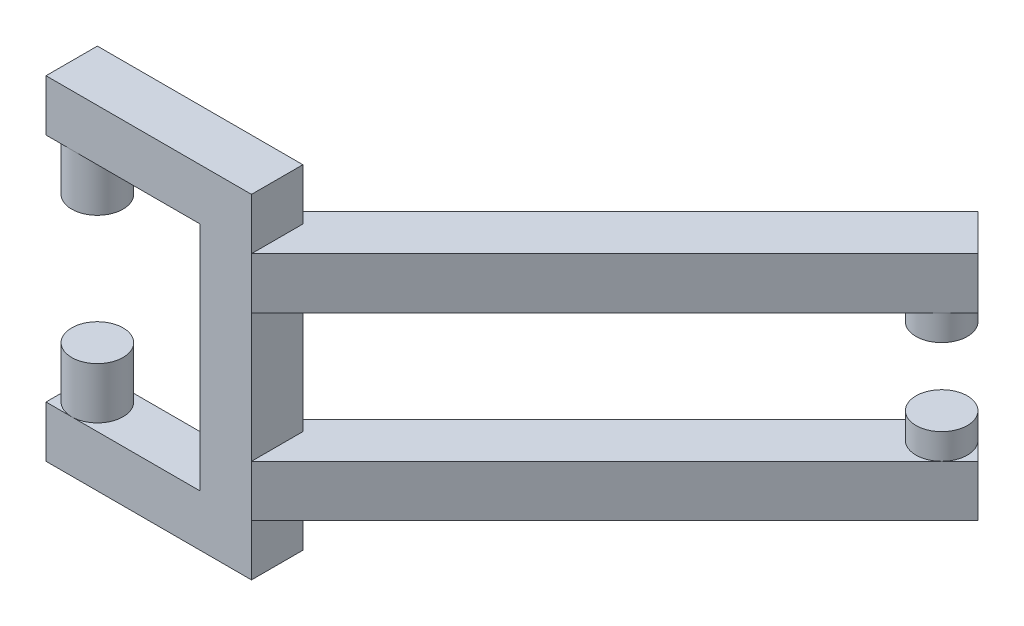
ISO-10303-21;
HEADER;
FILE_DESCRIPTION(('STEP AP214'),'2;1');
FILE_NAME('part.step','',(''),(''),'','','');
FILE_SCHEMA(('AUTOMOTIVE_DESIGN { 1 0 10303 214 1 1 1 1 }'));
ENDSEC;
DATA;
#1=APPLICATION_CONTEXT('core data for automotive mechanical design processes');
#2=APPLICATION_PROTOCOL_DEFINITION('international standard','automotive_design',2000,#1);
#3=PRODUCT_CONTEXT('',#1,'mechanical');
#4=PRODUCT('Part','Part','',(#3));
#5=PRODUCT_RELATED_PRODUCT_CATEGORY('part','',(#4));
#6=PRODUCT_DEFINITION_FORMATION('','',#4);
#7=PRODUCT_DEFINITION_CONTEXT('part definition',#1,'design');
#8=PRODUCT_DEFINITION('design','',#6,#7);
#9=PRODUCT_DEFINITION_SHAPE('','',#8);
#10=(LENGTH_UNIT() NAMED_UNIT(*) SI_UNIT(.MILLI.,.METRE.));
#11=(NAMED_UNIT(*) PLANE_ANGLE_UNIT() SI_UNIT($,.RADIAN.));
#12=(NAMED_UNIT(*) SI_UNIT($,.STERADIAN.) SOLID_ANGLE_UNIT());
#13=UNCERTAINTY_MEASURE_WITH_UNIT(LENGTH_MEASURE(1.E-05),#10,'distance_accuracy_value','');
#14=(GEOMETRIC_REPRESENTATION_CONTEXT(3) GLOBAL_UNCERTAINTY_ASSIGNED_CONTEXT((#13)) GLOBAL_UNIT_ASSIGNED_CONTEXT((#10,
#11,#12)) REPRESENTATION_CONTEXT('',''));
#15=CARTESIAN_POINT('',(0.,0.,0.));
#16=DIRECTION('',(0.,0.,1.));
#17=DIRECTION('',(1.,0.,0.));
#18=AXIS2_PLACEMENT_3D('',#15,#16,#17);
#19=CARTESIAN_POINT('',(0.,-45.,0.));
#20=DIRECTION('',(0.,-1.,0.));
#21=DIRECTION('',(0.,0.,1.));
#22=AXIS2_PLACEMENT_3D('',#19,#20,#21);
#23=PLANE('',#22);
#24=CARTESIAN_POINT('',(103.639610306789,-45.,-60.7106781186547));
#25=DIRECTION('',(0.,1.,0.));
#26=DIRECTION('',(0.,0.,1.));
#27=AXIS2_PLACEMENT_3D('',#24,#25,#26);
#28=CIRCLE('',#27,5.00000000000001);
#29=CARTESIAN_POINT('',(100.104076400857,-45.,-64.2462120245874));
#30=VERTEX_POINT('',#29);
#31=CARTESIAN_POINT('',(107.175144212722,-45.,-57.1751442127219));
#32=VERTEX_POINT('',#31);
#33=EDGE_CURVE('E216',#30,#32,#28,.T.);
#34=ORIENTED_EDGE('',*,*,#33,.F.);
#35=DIRECTION('',(0.707106781186549,0.,-0.707106781186546));
#36=VECTOR('',#35,1.);
#37=CARTESIAN_POINT('',(17.9289321881345,-45.,17.9289321881345));
#38=LINE('',#37,#36);
#39=CARTESIAN_POINT('',(35.8578643762691,-45.,0.));
#40=VERTEX_POINT('',#39);
#41=EDGE_CURVE('E198',#40,#30,#38,.T.);
#42=ORIENTED_EDGE('',*,*,#41,.F.);
#43=DIRECTION('',(-1.,0.,0.));
#44=VECTOR('',#43,1.);
#45=CARTESIAN_POINT('',(0.,-45.,0.));
#46=LINE('',#45,#44);
#47=CARTESIAN_POINT('',(40.,-45.,0.));
#48=VERTEX_POINT('',#47);
#49=EDGE_CURVE('E255',#48,#40,#46,.T.);
#50=ORIENTED_EDGE('',*,*,#49,.F.);
#51=DIRECTION('',(0.,0.,1.));
#52=VECTOR('',#51,1.);
#53=CARTESIAN_POINT('',(40.,-45.,10.));
#54=LINE('',#53,#52);
#55=CARTESIAN_POINT('',(40.,-45.,10.));
#56=VERTEX_POINT('',#55);
#57=EDGE_CURVE('E257',#48,#56,#54,.T.);
#58=ORIENTED_EDGE('',*,*,#57,.T.);
#59=DIRECTION('',(-0.707106781186549,0.,0.707106781186546));
#60=VECTOR('',#59,1.);
#61=CARTESIAN_POINT('',(24.9999999999999,-45.,25.));
#62=LINE('',#61,#60);
#63=EDGE_CURVE('E218',#32,#56,#62,.T.);
#64=ORIENTED_EDGE('',*,*,#63,.F.);
#65=EDGE_LOOP('',(#34,#42,#50,#58,#64));
#66=FACE_BOUND('',#65,.T.);
#67=ADVANCED_FACE('F35',(#66),#23,.F.);
#68=CARTESIAN_POINT('',(107.175144212722,-45.,-64.2462120245875));
#69=VERTEX_POINT('',#68);
#70=EDGE_CURVE('E50',#32,#69,#28,.T.);
#71=ORIENTED_EDGE('',*,*,#70,.F.);
#72=CARTESIAN_POINT('',(110.710678118655,-45.,-60.7106781186546));
#73=VERTEX_POINT('',#72);
#74=EDGE_CURVE('E236',#73,#32,#62,.T.);
#75=ORIENTED_EDGE('',*,*,#74,.F.);
#76=DIRECTION('',(0.707106781186548,0.,0.707106781186548));
#77=VECTOR('',#76,1.);
#78=CARTESIAN_POINT('',(85.7106781186548,-45.,-85.7106781186548));
#79=LINE('',#78,#77);
#80=EDGE_CURVE('E209',#69,#73,#79,.T.);
#81=ORIENTED_EDGE('',*,*,#80,.F.);
#82=EDGE_LOOP('',(#71,#75,#81));
#83=FACE_BOUND('',#82,.T.);
#84=ADVANCED_FACE('F506',(#83),#23,.F.);
#85=CARTESIAN_POINT('',(0.,-20.,0.));
#86=DIRECTION('',(0.,1.,0.));
#87=DIRECTION('',(0.,0.,1.));
#88=AXIS2_PLACEMENT_3D('',#85,#86,#87);
#89=PLANE('',#88);
#90=CARTESIAN_POINT('',(103.639610306789,-20.,-60.7106781186547));
#91=DIRECTION('',(0.,-1.,0.));
#92=DIRECTION('',(0.,0.,-1.));
#93=AXIS2_PLACEMENT_3D('',#90,#91,#92);
#94=CIRCLE('',#93,5.00000000000001);
#95=CARTESIAN_POINT('',(100.104076400857,-20.,-64.2462120245874));
#96=VERTEX_POINT('',#95);
#97=CARTESIAN_POINT('',(107.175144212722,-20.,-64.2462120245875));
#98=VERTEX_POINT('',#97);
#99=EDGE_CURVE('E233',#96,#98,#94,.T.);
#100=ORIENTED_EDGE('',*,*,#99,.F.);
#101=DIRECTION('',(0.707106781186549,0.,-0.707106781186546));
#102=VECTOR('',#101,1.);
#103=CARTESIAN_POINT('',(17.9289321881345,-20.,17.9289321881345));
#104=LINE('',#103,#102);
#105=CARTESIAN_POINT('',(103.639610306789,-20.,-67.7817459305201));
#106=VERTEX_POINT('',#105);
#107=EDGE_CURVE('E269',#96,#106,#104,.T.);
#108=ORIENTED_EDGE('',*,*,#107,.T.);
#109=DIRECTION('',(0.707106781186548,0.,0.707106781186548));
#110=VECTOR('',#109,1.);
#111=CARTESIAN_POINT('',(85.7106781186548,-20.,-85.7106781186548));
#112=LINE('',#111,#110);
#113=EDGE_CURVE('E266',#106,#98,#112,.T.);
#114=ORIENTED_EDGE('',*,*,#113,.T.);
#115=EDGE_LOOP('',(#100,#108,#114));
#116=FACE_BOUND('',#115,.T.);
#117=ADVANCED_FACE('F401',(#116),#89,.F.);
#118=CARTESIAN_POINT('',(107.175144212722,-20.,-57.1751442127219));
#119=VERTEX_POINT('',#118);
#120=EDGE_CURVE('E230',#98,#119,#94,.T.);
#121=ORIENTED_EDGE('',*,*,#120,.F.);
#122=CARTESIAN_POINT('',(110.710678118655,-20.,-60.7106781186546));
#123=VERTEX_POINT('',#122);
#124=EDGE_CURVE('E264',#98,#123,#112,.T.);
#125=ORIENTED_EDGE('',*,*,#124,.T.);
#126=DIRECTION('',(-0.707106781186549,0.,0.707106781186546));
#127=VECTOR('',#126,1.);
#128=CARTESIAN_POINT('',(24.9999999999999,-20.,25.));
#129=LINE('',#128,#127);
#130=EDGE_CURVE('E261',#123,#119,#129,.T.);
#131=ORIENTED_EDGE('',*,*,#130,.T.);
#132=EDGE_LOOP('',(#121,#125,#131));
#133=FACE_BOUND('',#132,.T.);
#134=ADVANCED_FACE('F411',(#133),#89,.F.);
#135=CARTESIAN_POINT('',(40.,0.,10.));
#136=DIRECTION('',(-1.,0.,0.));
#137=DIRECTION('',(0.,-1.,0.));
#138=AXIS2_PLACEMENT_3D('',#135,#136,#137);
#139=PLANE('',#138);
#140=ORIENTED_EDGE('',*,*,#57,.F.);
#141=DIRECTION('',(0.,1.,0.));
#142=VECTOR('',#141,1.);
#143=CARTESIAN_POINT('',(40.,0.,0.));
#144=LINE('',#143,#142);
#145=CARTESIAN_POINT('',(40.,-20.,0.));
#146=VERTEX_POINT('',#145);
#147=EDGE_CURVE('E356',#48,#146,#144,.T.);
#148=ORIENTED_EDGE('',*,*,#147,.T.);
#149=DIRECTION('',(0.,0.,-1.));
#150=VECTOR('',#149,1.);
#151=CARTESIAN_POINT('',(40.,-20.,10.));
#152=LINE('',#151,#150);
#153=CARTESIAN_POINT('',(40.,-20.,10.));
#154=VERTEX_POINT('',#153);
#155=EDGE_CURVE('E290',#154,#146,#152,.T.);
#156=ORIENTED_EDGE('',*,*,#155,.F.);
#157=DIRECTION('',(0.,1.,0.));
#158=VECTOR('',#157,1.);
#159=CARTESIAN_POINT('',(40.,0.,10.));
#160=LINE('',#159,#158);
#161=EDGE_CURVE('E333',#56,#154,#160,.T.);
#162=ORIENTED_EDGE('',*,*,#161,.F.);
#163=EDGE_LOOP('',(#140,#148,#156,#162));
#164=FACE_BOUND('',#163,.T.);
#165=ADVANCED_FACE('F431',(#164),#139,.F.);
#166=CARTESIAN_POINT('',(0.,0.,0.));
#167=DIRECTION('',(0.,0.,-1.));
#168=DIRECTION('',(-1.,0.,0.));
#169=AXIS2_PLACEMENT_3D('',#166,#167,#168);
#170=PLANE('',#169);
#171=ORIENTED_EDGE('',*,*,#147,.F.);
#172=ORIENTED_EDGE('',*,*,#49,.T.);
#173=DIRECTION('',(0.,1.,0.));
#174=VECTOR('',#173,1.);
#175=CARTESIAN_POINT('',(35.8578643762691,0.,0.));
#176=LINE('',#175,#174);
#177=CARTESIAN_POINT('',(35.8578643762691,-55.,0.));
#178=VERTEX_POINT('',#177);
#179=EDGE_CURVE('E205',#178,#40,#176,.T.);
#180=ORIENTED_EDGE('',*,*,#179,.F.);
#181=DIRECTION('',(-1.,0.,0.));
#182=VECTOR('',#181,1.);
#183=CARTESIAN_POINT('',(0.,-55.,0.));
#184=LINE('',#183,#182);
#185=CARTESIAN_POINT('',(40.,-55.,0.));
#186=VERTEX_POINT('',#185);
#187=EDGE_CURVE('E247',#186,#178,#184,.T.);
#188=ORIENTED_EDGE('',*,*,#187,.F.);
#189=CARTESIAN_POINT('',(40.,-65.,0.));
#190=VERTEX_POINT('',#189);
#191=EDGE_CURVE('E353',#190,#186,#144,.T.);
#192=ORIENTED_EDGE('',*,*,#191,.F.);
#193=DIRECTION('',(1.,0.,0.));
#194=VECTOR('',#193,1.);
#195=CARTESIAN_POINT('',(40.,-65.,0.));
#196=LINE('',#195,#194);
#197=CARTESIAN_POINT('',(0.,-65.,0.));
#198=VERTEX_POINT('',#197);
#199=EDGE_CURVE('E350',#198,#190,#196,.T.);
#200=ORIENTED_EDGE('',*,*,#199,.F.);
#201=DIRECTION('',(0.,-1.,0.));
#202=VECTOR('',#201,1.);
#203=CARTESIAN_POINT('',(0.,-65.,0.));
#204=LINE('',#203,#202);
#205=CARTESIAN_POINT('',(0.,-55.,0.));
#206=VERTEX_POINT('',#205);
#207=EDGE_CURVE('E348',#206,#198,#204,.T.);
#208=ORIENTED_EDGE('',*,*,#207,.F.);
#209=DIRECTION('',(-1.,0.,0.));
#210=VECTOR('',#209,1.);
#211=CARTESIAN_POINT('',(0.,-55.,0.));
#212=LINE('',#211,#210);
#213=CARTESIAN_POINT('',(5.,-55.,0.));
#214=VERTEX_POINT('',#213);
#215=EDGE_CURVE('E345',#214,#206,#212,.T.);
#216=ORIENTED_EDGE('',*,*,#215,.F.);
#217=CARTESIAN_POINT('',(30.,-55.,0.));
#218=VERTEX_POINT('',#217);
#219=EDGE_CURVE('E346',#218,#214,#212,.T.);
#220=ORIENTED_EDGE('',*,*,#219,.F.);
#221=DIRECTION('',(0.,-1.,0.));
#222=VECTOR('',#221,1.);
#223=CARTESIAN_POINT('',(30.,-55.,0.));
#224=LINE('',#223,#222);
#225=CARTESIAN_POINT('',(30.,-9.99999999999999,0.));
#226=VERTEX_POINT('',#225);
#227=EDGE_CURVE('E342',#226,#218,#224,.T.);
#228=ORIENTED_EDGE('',*,*,#227,.F.);
#229=DIRECTION('',(1.,0.,0.));
#230=VECTOR('',#229,1.);
#231=CARTESIAN_POINT('',(30.,-9.99999999999999,0.));
#232=LINE('',#231,#230);
#233=CARTESIAN_POINT('',(5.00000000000001,-10.,0.));
#234=VERTEX_POINT('',#233);
#235=EDGE_CURVE('E338',#234,#226,#232,.T.);
#236=ORIENTED_EDGE('',*,*,#235,.F.);
#237=CARTESIAN_POINT('',(0.,-10.,0.));
#238=VERTEX_POINT('',#237);
#239=EDGE_CURVE('E339',#238,#234,#232,.T.);
#240=ORIENTED_EDGE('',*,*,#239,.F.);
#241=DIRECTION('',(0.,-1.,0.));
#242=VECTOR('',#241,1.);
#243=CARTESIAN_POINT('',(0.,-10.,0.));
#244=LINE('',#243,#242);
#245=CARTESIAN_POINT('',(0.,0.,0.));
#246=VERTEX_POINT('',#245);
#247=EDGE_CURVE('E305',#246,#238,#244,.T.);
#248=ORIENTED_EDGE('',*,*,#247,.F.);
#249=DIRECTION('',(-1.,0.,0.));
#250=VECTOR('',#249,1.);
#251=CARTESIAN_POINT('',(0.,0.,0.));
#252=LINE('',#251,#250);
#253=CARTESIAN_POINT('',(40.,0.,0.));
#254=VERTEX_POINT('',#253);
#255=EDGE_CURVE('E314',#254,#246,#252,.T.);
#256=ORIENTED_EDGE('',*,*,#255,.F.);
#257=CARTESIAN_POINT('',(40.,-10.,0.));
#258=VERTEX_POINT('',#257);
#259=EDGE_CURVE('E352',#258,#254,#144,.T.);
#260=ORIENTED_EDGE('',*,*,#259,.F.);
#261=DIRECTION('',(1.,0.,0.));
#262=VECTOR('',#261,1.);
#263=CARTESIAN_POINT('',(0.,-10.,0.));
#264=LINE('',#263,#262);
#265=CARTESIAN_POINT('',(35.8578643762691,-10.,0.));
#266=VERTEX_POINT('',#265);
#267=EDGE_CURVE('E380',#266,#258,#264,.T.);
#268=ORIENTED_EDGE('',*,*,#267,.F.);
#269=DIRECTION('',(0.,-1.,0.));
#270=VECTOR('',#269,1.);
#271=CARTESIAN_POINT('',(35.8578643762691,0.,0.));
#272=LINE('',#271,#270);
#273=CARTESIAN_POINT('',(35.8578643762691,-20.,0.));
#274=VERTEX_POINT('',#273);
#275=EDGE_CURVE('E43',#266,#274,#272,.T.);
#276=ORIENTED_EDGE('',*,*,#275,.T.);
#277=DIRECTION('',(1.,0.,0.));
#278=VECTOR('',#277,1.);
#279=CARTESIAN_POINT('',(0.,-20.,0.));
#280=LINE('',#279,#278);
#281=EDGE_CURVE('E11',#274,#146,#280,.T.);
#282=ORIENTED_EDGE('',*,*,#281,.T.);
#283=EDGE_LOOP('',(#171,#172,#180,#188,#192,#200,#208,#216,#220,#228,#236,#240,#248,#256,#260,
#268,#276,#282));
#284=FACE_BOUND('',#283,.T.);
#285=ADVANCED_FACE('F386',(#284),#170,.T.);
#286=ORIENTED_EDGE('',*,*,#191,.T.);
#287=DIRECTION('',(0.,0.,1.));
#288=VECTOR('',#287,1.);
#289=CARTESIAN_POINT('',(40.,-55.,10.));
#290=LINE('',#289,#288);
#291=CARTESIAN_POINT('',(40.,-55.,9.99999999999999));
#292=VERTEX_POINT('',#291);
#293=EDGE_CURVE('E252',#186,#292,#290,.T.);
#294=ORIENTED_EDGE('',*,*,#293,.T.);
#295=CARTESIAN_POINT('',(40.,-65.,10.));
#296=VERTEX_POINT('',#295);
#297=EDGE_CURVE('E329',#296,#292,#160,.T.);
#298=ORIENTED_EDGE('',*,*,#297,.F.);
#299=DIRECTION('',(0.,0.,-1.));
#300=VECTOR('',#299,1.);
#301=CARTESIAN_POINT('',(40.,-65.,10.));
#302=LINE('',#301,#300);
#303=EDGE_CURVE('E363',#296,#190,#302,.T.);
#304=ORIENTED_EDGE('',*,*,#303,.T.);
#305=EDGE_LOOP('',(#286,#294,#298,#304));
#306=FACE_BOUND('',#305,.T.);
#307=ADVANCED_FACE('F437',(#306),#139,.F.);
#308=CARTESIAN_POINT('',(0.,-55.,10.));
#309=DIRECTION('',(0.,-1.,0.));
#310=DIRECTION('',(0.,0.,-1.));
#311=AXIS2_PLACEMENT_3D('',#308,#309,#310);
#312=PLANE('',#311);
#313=CARTESIAN_POINT('',(5.,-55.,5.));
#314=DIRECTION('',(0.,1.,0.));
#315=DIRECTION('',(0.,0.,1.));
#316=AXIS2_PLACEMENT_3D('',#313,#314,#315);
#317=CIRCLE('',#316,5.);
#318=CARTESIAN_POINT('',(0.,-55.,5.));
#319=VERTEX_POINT('',#318);
#320=EDGE_CURVE('E301',#214,#319,#317,.T.);
#321=ORIENTED_EDGE('',*,*,#320,.F.);
#322=ORIENTED_EDGE('',*,*,#215,.T.);
#323=DIRECTION('',(0.,0.,-1.));
#324=VECTOR('',#323,1.);
#325=CARTESIAN_POINT('',(0.,-55.,10.));
#326=LINE('',#325,#324);
#327=EDGE_CURVE('E369',#319,#206,#326,.T.);
#328=ORIENTED_EDGE('',*,*,#327,.F.);
#329=EDGE_LOOP('',(#321,#322,#328));
#330=FACE_BOUND('',#329,.T.);
#331=ADVANCED_FACE('F456',(#330),#312,.F.);
#332=CARTESIAN_POINT('',(5.,-55.,10.));
#333=VERTEX_POINT('',#332);
#334=EDGE_CURVE('E293',#319,#333,#317,.T.);
#335=ORIENTED_EDGE('',*,*,#334,.F.);
#336=CARTESIAN_POINT('',(0.,-55.,10.));
#337=VERTEX_POINT('',#336);
#338=EDGE_CURVE('E370',#337,#319,#326,.T.);
#339=ORIENTED_EDGE('',*,*,#338,.F.);
#340=DIRECTION('',(-1.,0.,0.));
#341=VECTOR('',#340,1.);
#342=CARTESIAN_POINT('',(0.,-55.,10.));
#343=LINE('',#342,#341);
#344=EDGE_CURVE('E320',#333,#337,#343,.T.);
#345=ORIENTED_EDGE('',*,*,#344,.F.);
#346=EDGE_LOOP('',(#335,#339,#345));
#347=FACE_BOUND('',#346,.T.);
#348=ADVANCED_FACE('F465',(#347),#312,.F.);
#349=CARTESIAN_POINT('',(30.,-9.99999999999999,10.));
#350=DIRECTION('',(0.,1.,0.));
#351=DIRECTION('',(-1.,0.,0.));
#352=AXIS2_PLACEMENT_3D('',#349,#350,#351);
#353=PLANE('',#352);
#354=CARTESIAN_POINT('',(5.,-10.,5.));
#355=DIRECTION('',(0.,-1.,0.));
#356=DIRECTION('',(1.,0.,0.));
#357=AXIS2_PLACEMENT_3D('',#354,#355,#356);
#358=CIRCLE('',#357,5.);
#359=CARTESIAN_POINT('',(0.,-10.,5.));
#360=VERTEX_POINT('',#359);
#361=EDGE_CURVE('E309',#360,#234,#358,.T.);
#362=ORIENTED_EDGE('',*,*,#361,.F.);
#363=DIRECTION('',(0.,0.,-1.));
#364=VECTOR('',#363,1.);
#365=CARTESIAN_POINT('',(0.,-10.,10.));
#366=LINE('',#365,#364);
#367=EDGE_CURVE('E377',#360,#238,#366,.T.);
#368=ORIENTED_EDGE('',*,*,#367,.T.);
#369=ORIENTED_EDGE('',*,*,#239,.T.);
#370=EDGE_LOOP('',(#362,#368,#369));
#371=FACE_BOUND('',#370,.T.);
#372=ADVANCED_FACE('F481',(#371),#353,.F.);
#373=CARTESIAN_POINT('',(5.00000000000001,-10.,10.));
#374=VERTEX_POINT('',#373);
#375=EDGE_CURVE('E297',#234,#374,#358,.T.);
#376=ORIENTED_EDGE('',*,*,#375,.F.);
#377=ORIENTED_EDGE('',*,*,#235,.T.);
#378=DIRECTION('',(0.,0.,-1.));
#379=VECTOR('',#378,1.);
#380=CARTESIAN_POINT('',(30.,-9.99999999999999,10.));
#381=LINE('',#380,#379);
#382=CARTESIAN_POINT('',(30.,-9.99999999999999,10.));
#383=VERTEX_POINT('',#382);
#384=EDGE_CURVE('E375',#383,#226,#381,.T.);
#385=ORIENTED_EDGE('',*,*,#384,.F.);
#386=DIRECTION('',(1.,0.,0.));
#387=VECTOR('',#386,1.);
#388=CARTESIAN_POINT('',(30.,-9.99999999999999,10.));
#389=LINE('',#388,#387);
#390=EDGE_CURVE('E313',#374,#383,#389,.T.);
#391=ORIENTED_EDGE('',*,*,#390,.F.);
#392=EDGE_LOOP('',(#376,#377,#385,#391));
#393=FACE_BOUND('',#392,.T.);
#394=ADVANCED_FACE('F489',(#393),#353,.F.);
#395=CARTESIAN_POINT('',(0.,-10.,10.));
#396=DIRECTION('',(1.,0.,0.));
#397=DIRECTION('',(0.,1.,0.));
#398=AXIS2_PLACEMENT_3D('',#395,#396,#397);
#399=PLANE('',#398);
#400=ORIENTED_EDGE('',*,*,#247,.T.);
#401=ORIENTED_EDGE('',*,*,#367,.F.);
#402=CARTESIAN_POINT('',(0.,-10.,10.));
#403=VERTEX_POINT('',#402);
#404=EDGE_CURVE('E378',#403,#360,#366,.T.);
#405=ORIENTED_EDGE('',*,*,#404,.F.);
#406=DIRECTION('',(0.,-1.,0.));
#407=VECTOR('',#406,1.);
#408=CARTESIAN_POINT('',(0.,-10.,10.));
#409=LINE('',#408,#407);
#410=CARTESIAN_POINT('',(0.,0.,10.));
#411=VERTEX_POINT('',#410);
#412=EDGE_CURVE('E310',#411,#403,#409,.T.);
#413=ORIENTED_EDGE('',*,*,#412,.F.);
#414=DIRECTION('',(0.,0.,-1.));
#415=VECTOR('',#414,1.);
#416=CARTESIAN_POINT('',(0.,0.,10.));
#417=LINE('',#416,#415);
#418=EDGE_CURVE('E335',#411,#246,#417,.T.);
#419=ORIENTED_EDGE('',*,*,#418,.T.);
#420=EDGE_LOOP('',(#400,#401,#405,#413,#419));
#421=FACE_BOUND('',#420,.T.);
#422=ADVANCED_FACE('F37',(#421),#399,.F.);
#423=EDGE_CURVE('E306',#374,#360,#358,.T.);
#424=ORIENTED_EDGE('',*,*,#423,.F.);
#425=EDGE_CURVE('E315',#403,#374,#389,.T.);
#426=ORIENTED_EDGE('',*,*,#425,.F.);
#427=ORIENTED_EDGE('',*,*,#404,.T.);
#428=EDGE_LOOP('',(#424,#426,#427));
#429=FACE_BOUND('',#428,.T.);
#430=ADVANCED_FACE('F487',(#429),#353,.F.);
#431=CARTESIAN_POINT('',(30.,-55.,10.));
#432=DIRECTION('',(1.,0.,0.));
#433=DIRECTION('',(0.,0.,-1.));
#434=AXIS2_PLACEMENT_3D('',#431,#432,#433);
#435=PLANE('',#434);
#436=ORIENTED_EDGE('',*,*,#227,.T.);
#437=DIRECTION('',(0.,0.,-1.));
#438=VECTOR('',#437,1.);
#439=CARTESIAN_POINT('',(30.,-55.,10.));
#440=LINE('',#439,#438);
#441=CARTESIAN_POINT('',(30.,-55.,10.));
#442=VERTEX_POINT('',#441);
#443=EDGE_CURVE('E373',#442,#218,#440,.T.);
#444=ORIENTED_EDGE('',*,*,#443,.F.);
#445=DIRECTION('',(0.,-1.,0.));
#446=VECTOR('',#445,1.);
#447=CARTESIAN_POINT('',(30.,-55.,10.));
#448=LINE('',#447,#446);
#449=EDGE_CURVE('E318',#383,#442,#448,.T.);
#450=ORIENTED_EDGE('',*,*,#449,.F.);
#451=ORIENTED_EDGE('',*,*,#384,.T.);
#452=EDGE_LOOP('',(#436,#444,#450,#451));
#453=FACE_BOUND('',#452,.T.);
#454=ADVANCED_FACE('F471',(#453),#435,.F.);
#455=EDGE_CURVE('E298',#333,#214,#317,.T.);
#456=ORIENTED_EDGE('',*,*,#455,.F.);
#457=EDGE_CURVE('E321',#442,#333,#343,.T.);
#458=ORIENTED_EDGE('',*,*,#457,.F.);
#459=ORIENTED_EDGE('',*,*,#443,.T.);
#460=ORIENTED_EDGE('',*,*,#219,.T.);
#461=EDGE_LOOP('',(#456,#458,#459,#460));
#462=FACE_BOUND('',#461,.T.);
#463=ADVANCED_FACE('F463',(#462),#312,.F.);
#464=CARTESIAN_POINT('',(0.,-65.,10.));
#465=DIRECTION('',(1.,0.,0.));
#466=DIRECTION('',(0.,1.,0.));
#467=AXIS2_PLACEMENT_3D('',#464,#465,#466);
#468=PLANE('',#467);
#469=ORIENTED_EDGE('',*,*,#207,.T.);
#470=DIRECTION('',(0.,0.,-1.));
#471=VECTOR('',#470,1.);
#472=CARTESIAN_POINT('',(0.,-65.,10.));
#473=LINE('',#472,#471);
#474=CARTESIAN_POINT('',(0.,-65.,10.));
#475=VERTEX_POINT('',#474);
#476=EDGE_CURVE('E366',#475,#198,#473,.T.);
#477=ORIENTED_EDGE('',*,*,#476,.F.);
#478=DIRECTION('',(0.,-1.,0.));
#479=VECTOR('',#478,1.);
#480=CARTESIAN_POINT('',(0.,-65.,10.));
#481=LINE('',#480,#479);
#482=EDGE_CURVE('E324',#337,#475,#481,.T.);
#483=ORIENTED_EDGE('',*,*,#482,.F.);
#484=ORIENTED_EDGE('',*,*,#338,.T.);
#485=ORIENTED_EDGE('',*,*,#327,.T.);
#486=EDGE_LOOP('',(#469,#477,#483,#484,#485));
#487=FACE_BOUND('',#486,.T.);
#488=ADVANCED_FACE('F450',(#487),#468,.F.);
#489=CARTESIAN_POINT('',(40.,-65.,10.));
#490=DIRECTION('',(0.,1.,0.));
#491=DIRECTION('',(-1.,0.,0.));
#492=AXIS2_PLACEMENT_3D('',#489,#490,#491);
#493=PLANE('',#492);
#494=ORIENTED_EDGE('',*,*,#199,.T.);
#495=ORIENTED_EDGE('',*,*,#303,.F.);
#496=DIRECTION('',(1.,0.,0.));
#497=VECTOR('',#496,1.);
#498=CARTESIAN_POINT('',(40.,-65.,10.));
#499=LINE('',#498,#497);
#500=EDGE_CURVE('E326',#475,#296,#499,.T.);
#501=ORIENTED_EDGE('',*,*,#500,.F.);
#502=ORIENTED_EDGE('',*,*,#476,.T.);
#503=EDGE_LOOP('',(#494,#495,#501,#502));
#504=FACE_BOUND('',#503,.T.);
#505=ADVANCED_FACE('F442',(#504),#493,.F.);
#506=CARTESIAN_POINT('',(40.,-10.,10.));
#507=VERTEX_POINT('',#506);
#508=CARTESIAN_POINT('',(40.,0.,10.));
#509=VERTEX_POINT('',#508);
#510=EDGE_CURVE('E328',#507,#509,#160,.T.);
#511=ORIENTED_EDGE('',*,*,#510,.F.);
#512=DIRECTION('',(0.,0.,-1.));
#513=VECTOR('',#512,1.);
#514=CARTESIAN_POINT('',(40.,-10.,10.));
#515=LINE('',#514,#513);
#516=EDGE_CURVE('E282',#507,#258,#515,.T.);
#517=ORIENTED_EDGE('',*,*,#516,.T.);
#518=ORIENTED_EDGE('',*,*,#259,.T.);
#519=DIRECTION('',(0.,0.,-1.));
#520=VECTOR('',#519,1.);
#521=CARTESIAN_POINT('',(40.,0.,10.));
#522=LINE('',#521,#520);
#523=EDGE_CURVE('E360',#509,#254,#522,.T.);
#524=ORIENTED_EDGE('',*,*,#523,.F.);
#525=EDGE_LOOP('',(#511,#517,#518,#524));
#526=FACE_BOUND('',#525,.T.);
#527=ADVANCED_FACE('F422',(#526),#139,.F.);
#528=CARTESIAN_POINT('',(0.,0.,10.));
#529=DIRECTION('',(0.,-1.,0.));
#530=DIRECTION('',(0.,0.,-1.));
#531=AXIS2_PLACEMENT_3D('',#528,#529,#530);
#532=PLANE('',#531);
#533=ORIENTED_EDGE('',*,*,#255,.T.);
#534=ORIENTED_EDGE('',*,*,#418,.F.);
#535=DIRECTION('',(-1.,0.,0.));
#536=VECTOR('',#535,1.);
#537=CARTESIAN_POINT('',(0.,0.,10.));
#538=LINE('',#537,#536);
#539=EDGE_CURVE('E332',#509,#411,#538,.T.);
#540=ORIENTED_EDGE('',*,*,#539,.F.);
#541=ORIENTED_EDGE('',*,*,#523,.T.);
#542=EDGE_LOOP('',(#533,#534,#540,#541));
#543=FACE_BOUND('',#542,.T.);
#544=ADVANCED_FACE('F495',(#543),#532,.F.);
#545=CARTESIAN_POINT('',(0.,0.,10.));
#546=DIRECTION('',(0.,0.,-1.));
#547=DIRECTION('',(-1.,0.,0.));
#548=AXIS2_PLACEMENT_3D('',#545,#546,#547);
#549=PLANE('',#548);
#550=ORIENTED_EDGE('',*,*,#297,.T.);
#551=DIRECTION('',(0.,-1.,0.));
#552=VECTOR('',#551,1.);
#553=CARTESIAN_POINT('',(40.,-45.,9.99999999999999));
#554=LINE('',#553,#552);
#555=EDGE_CURVE('E245',#56,#292,#554,.T.);
#556=ORIENTED_EDGE('',*,*,#555,.F.);
#557=ORIENTED_EDGE('',*,*,#161,.T.);
#558=DIRECTION('',(0.,1.,0.));
#559=VECTOR('',#558,1.);
#560=CARTESIAN_POINT('',(40.,-20.,9.99999999999999));
#561=LINE('',#560,#559);
#562=EDGE_CURVE('E272',#154,#507,#561,.T.);
#563=ORIENTED_EDGE('',*,*,#562,.T.);
#564=ORIENTED_EDGE('',*,*,#510,.T.);
#565=ORIENTED_EDGE('',*,*,#539,.T.);
#566=ORIENTED_EDGE('',*,*,#412,.T.);
#567=ORIENTED_EDGE('',*,*,#425,.T.);
#568=ORIENTED_EDGE('',*,*,#390,.T.);
#569=ORIENTED_EDGE('',*,*,#449,.T.);
#570=ORIENTED_EDGE('',*,*,#457,.T.);
#571=ORIENTED_EDGE('',*,*,#344,.T.);
#572=ORIENTED_EDGE('',*,*,#482,.T.);
#573=ORIENTED_EDGE('',*,*,#500,.T.);
#574=EDGE_LOOP('',(#550,#556,#557,#563,#564,#565,#566,#567,#568,#569,#570,#571,#572,#573));
#575=FACE_BOUND('',#574,.T.);
#576=ADVANCED_FACE('F426',(#575),#549,.F.);
#577=CARTESIAN_POINT('',(5.,-20.,5.));
#578=DIRECTION('',(0.,1.,0.));
#579=DIRECTION('',(-1.,0.,0.));
#580=AXIS2_PLACEMENT_3D('',#577,#578,#579);
#581=CYLINDRICAL_SURFACE('',#580,5.);
#582=CARTESIAN_POINT('',(5.,-20.,5.));
#583=DIRECTION('',(0.,-1.,0.));
#584=DIRECTION('',(1.,0.,0.));
#585=AXIS2_PLACEMENT_3D('',#582,#583,#584);
#586=CIRCLE('',#585,5.);
#587=CARTESIAN_POINT('',(10.,-20.,5.));
#588=VERTEX_POINT('',#587);
#589=EDGE_CURVE('E302',#588,#588,#586,.T.);
#590=ORIENTED_EDGE('',*,*,#589,.F.);
#591=EDGE_LOOP('',(#590));
#592=FACE_BOUND('',#591,.T.);
#593=ORIENTED_EDGE('',*,*,#423,.T.);
#594=ORIENTED_EDGE('',*,*,#361,.T.);
#595=ORIENTED_EDGE('',*,*,#375,.T.);
#596=EDGE_LOOP('',(#593,#594,#595));
#597=FACE_BOUND('',#596,.T.);
#598=ADVANCED_FACE('F485',(#592,#597),#581,.T.);
#599=CARTESIAN_POINT('',(5.,-20.,5.));
#600=DIRECTION('',(0.,-1.,0.));
#601=DIRECTION('',(1.,0.,0.));
#602=AXIS2_PLACEMENT_3D('',#599,#600,#601);
#603=PLANE('',#602);
#604=ORIENTED_EDGE('',*,*,#589,.T.);
#605=EDGE_LOOP('',(#604));
#606=FACE_BOUND('',#605,.T.);
#607=ADVANCED_FACE('F533',(#606),#603,.T.);
#608=CARTESIAN_POINT('',(5.,-45.,5.));
#609=DIRECTION('',(0.,-1.,0.));
#610=DIRECTION('',(0.,0.,-1.));
#611=AXIS2_PLACEMENT_3D('',#608,#609,#610);
#612=CYLINDRICAL_SURFACE('',#611,5.);
#613=CARTESIAN_POINT('',(5.,-45.,5.));
#614=DIRECTION('',(0.,1.,0.));
#615=DIRECTION('',(0.,0.,1.));
#616=AXIS2_PLACEMENT_3D('',#613,#614,#615);
#617=CIRCLE('',#616,5.);
#618=CARTESIAN_POINT('',(5.,-45.,10.));
#619=VERTEX_POINT('',#618);
#620=EDGE_CURVE('E294',#619,#619,#617,.T.);
#621=ORIENTED_EDGE('',*,*,#620,.F.);
#622=EDGE_LOOP('',(#621));
#623=FACE_BOUND('',#622,.T.);
#624=ORIENTED_EDGE('',*,*,#455,.T.);
#625=ORIENTED_EDGE('',*,*,#320,.T.);
#626=ORIENTED_EDGE('',*,*,#334,.T.);
#627=EDGE_LOOP('',(#624,#625,#626));
#628=FACE_BOUND('',#627,.T.);
#629=ADVANCED_FACE('F459',(#623,#628),#612,.T.);
#630=CARTESIAN_POINT('',(5.,-45.,5.));
#631=DIRECTION('',(0.,1.,0.));
#632=DIRECTION('',(0.,0.,1.));
#633=AXIS2_PLACEMENT_3D('',#630,#631,#632);
#634=PLANE('',#633);
#635=ORIENTED_EDGE('',*,*,#620,.T.);
#636=EDGE_LOOP('',(#635));
#637=FACE_BOUND('',#636,.T.);
#638=ADVANCED_FACE('F527',(#637),#634,.T.);
#639=EDGE_CURVE('E232',#119,#96,#94,.T.);
#640=ORIENTED_EDGE('',*,*,#639,.F.);
#641=EDGE_CURVE('E265',#119,#154,#129,.T.);
#642=ORIENTED_EDGE('',*,*,#641,.T.);
#643=ORIENTED_EDGE('',*,*,#155,.T.);
#644=ORIENTED_EDGE('',*,*,#281,.F.);
#645=EDGE_CURVE('E270',#274,#96,#104,.T.);
#646=ORIENTED_EDGE('',*,*,#645,.T.);
#647=EDGE_LOOP('',(#640,#642,#643,#644,#646));
#648=FACE_BOUND('',#647,.T.);
#649=ADVANCED_FACE('F391',(#648),#89,.F.);
#650=CARTESIAN_POINT('',(0.,-10.,0.));
#651=DIRECTION('',(0.,1.,0.));
#652=DIRECTION('',(0.,0.,1.));
#653=AXIS2_PLACEMENT_3D('',#650,#651,#652);
#654=PLANE('',#653);
#655=ORIENTED_EDGE('',*,*,#516,.F.);
#656=DIRECTION('',(-0.707106781186549,0.,0.707106781186546));
#657=VECTOR('',#656,1.);
#658=CARTESIAN_POINT('',(24.9999999999999,-10.,25.));
#659=LINE('',#658,#657);
#660=CARTESIAN_POINT('',(110.710678118655,-10.,-60.7106781186546));
#661=VERTEX_POINT('',#660);
#662=EDGE_CURVE('E260',#661,#507,#659,.T.);
#663=ORIENTED_EDGE('',*,*,#662,.F.);
#664=DIRECTION('',(0.707106781186548,0.,0.707106781186548));
#665=VECTOR('',#664,1.);
#666=CARTESIAN_POINT('',(85.7106781186548,-10.,-85.7106781186548));
#667=LINE('',#666,#665);
#668=CARTESIAN_POINT('',(103.639610306789,-10.,-67.7817459305201));
#669=VERTEX_POINT('',#668);
#670=EDGE_CURVE('E275',#669,#661,#667,.T.);
#671=ORIENTED_EDGE('',*,*,#670,.F.);
#672=DIRECTION('',(0.707106781186549,0.,-0.707106781186546));
#673=VECTOR('',#672,1.);
#674=CARTESIAN_POINT('',(17.9289321881345,-10.,17.9289321881345));
#675=LINE('',#674,#673);
#676=EDGE_CURVE('E277',#266,#669,#675,.T.);
#677=ORIENTED_EDGE('',*,*,#676,.F.);
#678=ORIENTED_EDGE('',*,*,#267,.T.);
#679=EDGE_LOOP('',(#655,#663,#671,#677,#678));
#680=FACE_BOUND('',#679,.T.);
#681=ADVANCED_FACE('F420',(#680),#654,.T.);
#682=CARTESIAN_POINT('',(17.9289321881345,-20.,17.9289321881345));
#683=DIRECTION('',(0.707106781186546,0.,0.707106781186549));
#684=DIRECTION('',(0.707106781186549,0.,-0.707106781186546));
#685=AXIS2_PLACEMENT_3D('',#682,#683,#684);
#686=PLANE('',#685);
#687=ORIENTED_EDGE('',*,*,#275,.F.);
#688=ORIENTED_EDGE('',*,*,#676,.T.);
#689=DIRECTION('',(0.,1.,0.));
#690=VECTOR('',#689,1.);
#691=CARTESIAN_POINT('',(103.639610306789,-20.,-67.7817459305201));
#692=LINE('',#691,#690);
#693=EDGE_CURVE('E279',#106,#669,#692,.T.);
#694=ORIENTED_EDGE('',*,*,#693,.F.);
#695=ORIENTED_EDGE('',*,*,#107,.F.);
#696=ORIENTED_EDGE('',*,*,#645,.F.);
#697=EDGE_LOOP('',(#687,#688,#694,#695,#696));
#698=FACE_BOUND('',#697,.T.);
#699=ADVANCED_FACE('F394',(#698),#686,.F.);
#700=CARTESIAN_POINT('',(85.7106781186548,-20.,-85.7106781186548));
#701=DIRECTION('',(-0.707106781186548,0.,0.707106781186548));
#702=DIRECTION('',(0.707106781186548,0.,0.707106781186548));
#703=AXIS2_PLACEMENT_3D('',#700,#701,#702);
#704=PLANE('',#703);
#705=ORIENTED_EDGE('',*,*,#670,.T.);
#706=DIRECTION('',(0.,1.,0.));
#707=VECTOR('',#706,1.);
#708=CARTESIAN_POINT('',(110.710678118655,-20.,-60.7106781186546));
#709=LINE('',#708,#707);
#710=EDGE_CURVE('E283',#123,#661,#709,.T.);
#711=ORIENTED_EDGE('',*,*,#710,.F.);
#712=ORIENTED_EDGE('',*,*,#124,.F.);
#713=ORIENTED_EDGE('',*,*,#113,.F.);
#714=ORIENTED_EDGE('',*,*,#693,.T.);
#715=EDGE_LOOP('',(#705,#711,#712,#713,#714));
#716=FACE_BOUND('',#715,.T.);
#717=ADVANCED_FACE('F415',(#716),#704,.F.);
#718=CARTESIAN_POINT('',(24.9999999999999,-20.,25.));
#719=DIRECTION('',(-0.707106781186546,0.,-0.707106781186549));
#720=DIRECTION('',(-0.707106781186549,0.,0.707106781186546));
#721=AXIS2_PLACEMENT_3D('',#718,#719,#720);
#722=PLANE('',#721);
#723=ORIENTED_EDGE('',*,*,#662,.T.);
#724=ORIENTED_EDGE('',*,*,#562,.F.);
#725=ORIENTED_EDGE('',*,*,#641,.F.);
#726=ORIENTED_EDGE('',*,*,#130,.F.);
#727=ORIENTED_EDGE('',*,*,#710,.T.);
#728=EDGE_LOOP('',(#723,#724,#725,#726,#727));
#729=FACE_BOUND('',#728,.T.);
#730=ADVANCED_FACE('F409',(#729),#722,.F.);
#731=EDGE_CURVE('E58',#69,#30,#28,.T.);
#732=ORIENTED_EDGE('',*,*,#731,.F.);
#733=CARTESIAN_POINT('',(103.639610306789,-45.,-67.7817459305201));
#734=VERTEX_POINT('',#733);
#735=EDGE_CURVE('E213',#734,#69,#79,.T.);
#736=ORIENTED_EDGE('',*,*,#735,.F.);
#737=EDGE_CURVE('E202',#30,#734,#38,.T.);
#738=ORIENTED_EDGE('',*,*,#737,.F.);
#739=EDGE_LOOP('',(#732,#736,#738));
#740=FACE_BOUND('',#739,.T.);
#741=ADVANCED_FACE('F211',(#740),#23,.F.);
#742=CARTESIAN_POINT('',(0.,-55.,0.));
#743=DIRECTION('',(0.,-1.,0.));
#744=DIRECTION('',(0.,0.,1.));
#745=AXIS2_PLACEMENT_3D('',#742,#743,#744);
#746=PLANE('',#745);
#747=ORIENTED_EDGE('',*,*,#293,.F.);
#748=ORIENTED_EDGE('',*,*,#187,.T.);
#749=DIRECTION('',(0.707106781186549,0.,-0.707106781186546));
#750=VECTOR('',#749,1.);
#751=CARTESIAN_POINT('',(17.9289321881345,-55.,17.9289321881345));
#752=LINE('',#751,#750);
#753=CARTESIAN_POINT('',(103.639610306789,-55.,-67.7817459305201));
#754=VERTEX_POINT('',#753);
#755=EDGE_CURVE('E229',#178,#754,#752,.T.);
#756=ORIENTED_EDGE('',*,*,#755,.T.);
#757=DIRECTION('',(0.707106781186548,0.,0.707106781186548));
#758=VECTOR('',#757,1.);
#759=CARTESIAN_POINT('',(85.7106781186548,-55.,-85.7106781186548));
#760=LINE('',#759,#758);
#761=CARTESIAN_POINT('',(110.710678118655,-55.,-60.7106781186546));
#762=VERTEX_POINT('',#761);
#763=EDGE_CURVE('E240',#754,#762,#760,.T.);
#764=ORIENTED_EDGE('',*,*,#763,.T.);
#765=DIRECTION('',(-0.707106781186549,0.,0.707106781186546));
#766=VECTOR('',#765,1.);
#767=CARTESIAN_POINT('',(24.9999999999999,-55.,25.));
#768=LINE('',#767,#766);
#769=EDGE_CURVE('E214',#762,#292,#768,.T.);
#770=ORIENTED_EDGE('',*,*,#769,.T.);
#771=EDGE_LOOP('',(#747,#748,#756,#764,#770));
#772=FACE_BOUND('',#771,.T.);
#773=ADVANCED_FACE('F514',(#772),#746,.T.);
#774=CARTESIAN_POINT('',(24.9999999999999,-45.,25.));
#775=DIRECTION('',(0.707106781186546,0.,0.707106781186549));
#776=DIRECTION('',(0.707106781186549,0.,-0.707106781186546));
#777=AXIS2_PLACEMENT_3D('',#774,#775,#776);
#778=PLANE('',#777);
#779=ORIENTED_EDGE('',*,*,#769,.F.);
#780=DIRECTION('',(0.,-1.,0.));
#781=VECTOR('',#780,1.);
#782=CARTESIAN_POINT('',(110.710678118655,-45.,-60.7106781186546));
#783=LINE('',#782,#781);
#784=EDGE_CURVE('E248',#73,#762,#783,.T.);
#785=ORIENTED_EDGE('',*,*,#784,.F.);
#786=ORIENTED_EDGE('',*,*,#74,.T.);
#787=ORIENTED_EDGE('',*,*,#63,.T.);
#788=ORIENTED_EDGE('',*,*,#555,.T.);
#789=EDGE_LOOP('',(#779,#785,#786,#787,#788));
#790=FACE_BOUND('',#789,.T.);
#791=ADVANCED_FACE('F519',(#790),#778,.T.);
#792=CARTESIAN_POINT('',(85.7106781186548,-45.,-85.7106781186548));
#793=DIRECTION('',(0.707106781186548,0.,-0.707106781186548));
#794=DIRECTION('',(-0.707106781186548,0.,-0.707106781186548));
#795=AXIS2_PLACEMENT_3D('',#792,#793,#794);
#796=PLANE('',#795);
#797=ORIENTED_EDGE('',*,*,#763,.F.);
#798=DIRECTION('',(0.,-1.,0.));
#799=VECTOR('',#798,1.);
#800=CARTESIAN_POINT('',(103.639610306789,-45.,-67.7817459305201));
#801=LINE('',#800,#799);
#802=EDGE_CURVE('E238',#734,#754,#801,.T.);
#803=ORIENTED_EDGE('',*,*,#802,.F.);
#804=ORIENTED_EDGE('',*,*,#735,.T.);
#805=ORIENTED_EDGE('',*,*,#80,.T.);
#806=ORIENTED_EDGE('',*,*,#784,.T.);
#807=EDGE_LOOP('',(#797,#803,#804,#805,#806));
#808=FACE_BOUND('',#807,.T.);
#809=ADVANCED_FACE('F702',(#808),#796,.T.);
#810=CARTESIAN_POINT('',(17.9289321881345,-45.,17.9289321881345));
#811=DIRECTION('',(-0.707106781186546,0.,-0.707106781186549));
#812=DIRECTION('',(-0.707106781186549,0.,0.707106781186546));
#813=AXIS2_PLACEMENT_3D('',#810,#811,#812);
#814=PLANE('',#813);
#815=ORIENTED_EDGE('',*,*,#755,.F.);
#816=ORIENTED_EDGE('',*,*,#179,.T.);
#817=ORIENTED_EDGE('',*,*,#41,.T.);
#818=ORIENTED_EDGE('',*,*,#737,.T.);
#819=ORIENTED_EDGE('',*,*,#802,.T.);
#820=EDGE_LOOP('',(#815,#816,#817,#818,#819));
#821=FACE_BOUND('',#820,.T.);
#822=ADVANCED_FACE('F200',(#821),#814,.T.);
#823=CARTESIAN_POINT('',(103.639610306789,-25.,-60.7106781186547));
#824=DIRECTION('',(0.,1.,0.));
#825=DIRECTION('',(0.,0.,1.));
#826=AXIS2_PLACEMENT_3D('',#823,#824,#825);
#827=CYLINDRICAL_SURFACE('',#826,5.00000000000001);
#828=CARTESIAN_POINT('',(103.639610306789,-25.,-60.7106781186547));
#829=DIRECTION('',(0.,-1.,0.));
#830=DIRECTION('',(0.,0.,-1.));
#831=AXIS2_PLACEMENT_3D('',#828,#829,#830);
#832=CIRCLE('',#831,5.00000000000001);
#833=CARTESIAN_POINT('',(103.639610306789,-25.,-65.7106781186547));
#834=VERTEX_POINT('',#833);
#835=EDGE_CURVE('E226',#834,#834,#832,.T.);
#836=ORIENTED_EDGE('',*,*,#835,.F.);
#837=EDGE_LOOP('',(#836));
#838=FACE_BOUND('',#837,.T.);
#839=ORIENTED_EDGE('',*,*,#120,.T.);
#840=ORIENTED_EDGE('',*,*,#639,.T.);
#841=ORIENTED_EDGE('',*,*,#99,.T.);
#842=EDGE_LOOP('',(#839,#840,#841));
#843=FACE_BOUND('',#842,.T.);
#844=ADVANCED_FACE('F403',(#838,#843),#827,.T.);
#845=CARTESIAN_POINT('',(103.639610306789,-25.,-60.7106781186547));
#846=DIRECTION('',(0.,-1.,0.));
#847=DIRECTION('',(0.,0.,-1.));
#848=AXIS2_PLACEMENT_3D('',#845,#846,#847);
#849=PLANE('',#848);
#850=ORIENTED_EDGE('',*,*,#835,.T.);
#851=EDGE_LOOP('',(#850));
#852=FACE_BOUND('',#851,.T.);
#853=ADVANCED_FACE('F663',(#852),#849,.T.);
#854=CARTESIAN_POINT('',(103.639610306789,-40.,-60.7106781186547));
#855=DIRECTION('',(0.,-1.,0.));
#856=DIRECTION('',(0.,0.,-1.));
#857=AXIS2_PLACEMENT_3D('',#854,#855,#856);
#858=CYLINDRICAL_SURFACE('',#857,5.00000000000001);
#859=CARTESIAN_POINT('',(103.639610306789,-40.,-60.7106781186547));
#860=DIRECTION('',(0.,1.,0.));
#861=DIRECTION('',(0.,0.,1.));
#862=AXIS2_PLACEMENT_3D('',#859,#860,#861);
#863=CIRCLE('',#862,5.00000000000001);
#864=CARTESIAN_POINT('',(103.639610306789,-40.,-55.7106781186547));
#865=VERTEX_POINT('',#864);
#866=EDGE_CURVE('E223',#865,#865,#863,.T.);
#867=ORIENTED_EDGE('',*,*,#866,.F.);
#868=EDGE_LOOP('',(#867));
#869=FACE_BOUND('',#868,.T.);
#870=ORIENTED_EDGE('',*,*,#70,.T.);
#871=ORIENTED_EDGE('',*,*,#731,.T.);
#872=ORIENTED_EDGE('',*,*,#33,.T.);
#873=EDGE_LOOP('',(#870,#871,#872));
#874=FACE_BOUND('',#873,.T.);
#875=ADVANCED_FACE('F222',(#869,#874),#858,.T.);
#876=CARTESIAN_POINT('',(103.639610306789,-40.,-60.7106781186547));
#877=DIRECTION('',(0.,1.,0.));
#878=DIRECTION('',(0.,0.,1.));
#879=AXIS2_PLACEMENT_3D('',#876,#877,#878);
#880=PLANE('',#879);
#881=ORIENTED_EDGE('',*,*,#866,.T.);
#882=EDGE_LOOP('',(#881));
#883=FACE_BOUND('',#882,.T.);
#884=ADVANCED_FACE('F727',(#883),#880,.T.);
#885=CLOSED_SHELL('',(#67,#84,#117,#134,#165,#285,#307,#331,#348,#372,#394,#422,#430,#454,#463,
#488,#505,#527,#544,#576,#598,#607,#629,#638,#649,#681,#699,#717,#730,#741,#773,#791,#809,#822,
#844,#853,#875,#884));
#886=MANIFOLD_SOLID_BREP('B2',#885);
#887=ADVANCED_BREP_SHAPE_REPRESENTATION('',(#18,#886),#14);
#888=SHAPE_DEFINITION_REPRESENTATION(#9,#887);
ENDSEC;
END-ISO-10303-21;
